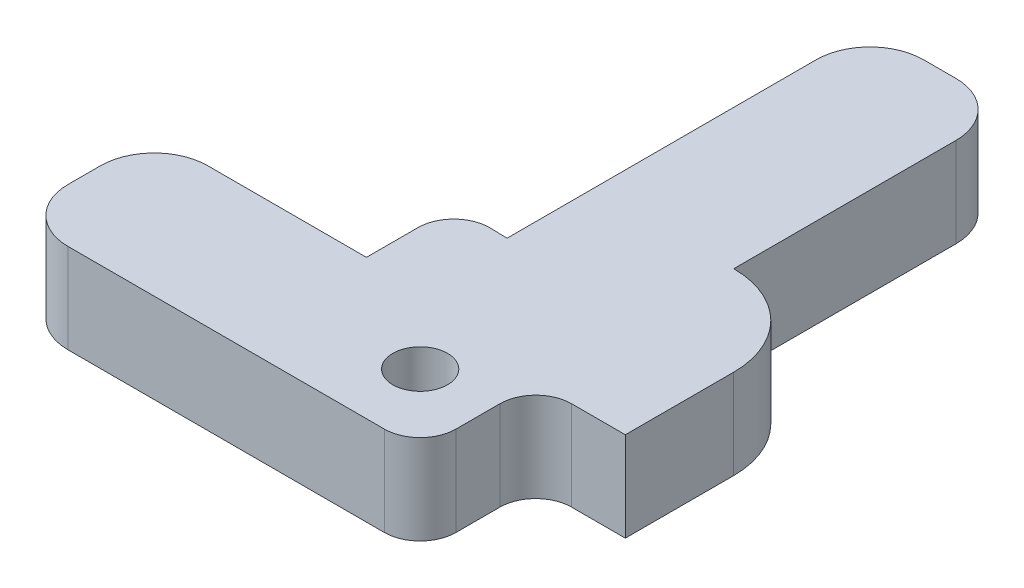
ISO-10303-21;
HEADER;
FILE_DESCRIPTION(('STEP AP214'),'2;1');
FILE_NAME('part.step','',(''),(''),'','','');
FILE_SCHEMA(('AUTOMOTIVE_DESIGN { 1 0 10303 214 1 1 1 1 }'));
ENDSEC;
DATA;
#1=APPLICATION_CONTEXT('core data for automotive mechanical design processes');
#2=APPLICATION_PROTOCOL_DEFINITION('international standard','automotive_design',2000,#1);
#3=PRODUCT_CONTEXT('',#1,'mechanical');
#4=PRODUCT('Part','Part','',(#3));
#5=PRODUCT_RELATED_PRODUCT_CATEGORY('part','',(#4));
#6=PRODUCT_DEFINITION_FORMATION('','',#4);
#7=PRODUCT_DEFINITION_CONTEXT('part definition',#1,'design');
#8=PRODUCT_DEFINITION('design','',#6,#7);
#9=PRODUCT_DEFINITION_SHAPE('','',#8);
#10=(LENGTH_UNIT() NAMED_UNIT(*) SI_UNIT(.MILLI.,.METRE.));
#11=(NAMED_UNIT(*) PLANE_ANGLE_UNIT() SI_UNIT($,.RADIAN.));
#12=(NAMED_UNIT(*) SI_UNIT($,.STERADIAN.) SOLID_ANGLE_UNIT());
#13=UNCERTAINTY_MEASURE_WITH_UNIT(LENGTH_MEASURE(1.E-05),#10,'distance_accuracy_value','');
#14=(GEOMETRIC_REPRESENTATION_CONTEXT(3) GLOBAL_UNCERTAINTY_ASSIGNED_CONTEXT((#13)) GLOBAL_UNIT_ASSIGNED_CONTEXT((#10,
#11,#12)) REPRESENTATION_CONTEXT('',''));
#15=CARTESIAN_POINT('',(0.,0.,0.));
#16=DIRECTION('',(0.,0.,1.));
#17=DIRECTION('',(1.,0.,0.));
#18=AXIS2_PLACEMENT_3D('',#15,#16,#17);
#19=CARTESIAN_POINT('',(0.211176136896889,5.,-8.64962778558641));
#20=DIRECTION('',(-0.0244072037228938,0.,0.999702099830959));
#21=DIRECTION('',(0.999702099830959,0.,0.0244072037228938));
#22=AXIS2_PLACEMENT_3D('',#19,#20,#21);
#23=PLANE('',#22);
#24=DIRECTION('',(0.,-1.,0.));
#25=VECTOR('',#24,1.);
#26=CARTESIAN_POINT('',(-3.9,5.,-8.75));
#27=LINE('',#26,#25);
#28=CARTESIAN_POINT('',(-3.9,5.,-8.75));
#29=VERTEX_POINT('',#28);
#30=CARTESIAN_POINT('',(-3.9,0.,-8.75));
#31=VERTEX_POINT('',#30);
#32=EDGE_CURVE('E300',#29,#31,#27,.T.);
#33=ORIENTED_EDGE('',*,*,#32,.T.);
#34=DIRECTION('',(0.,1.,0.));
#35=VECTOR('',#34,1.);
#36=CARTESIAN_POINT('',(-3.9,-4.,-8.75));
#37=LINE('',#36,#35);
#38=CARTESIAN_POINT('',(-3.9,-4.,-8.75));
#39=VERTEX_POINT('',#38);
#40=EDGE_CURVE('E233',#39,#31,#37,.T.);
#41=ORIENTED_EDGE('',*,*,#40,.F.);
#42=DIRECTION('',(-0.999702099830959,0.,-0.0244072037228938));
#43=VECTOR('',#42,1.);
#44=CARTESIAN_POINT('',(-3.9,-4.,-8.75));
#45=LINE('',#44,#43);
#46=CARTESIAN_POINT('',(-4.8511855925542,-4.,-8.77322269858158));
#47=VERTEX_POINT('',#46);
#48=EDGE_CURVE('E225',#39,#47,#45,.T.);
#49=ORIENTED_EDGE('',*,*,#48,.T.);
#50=DIRECTION('',(0.,-1.,0.));
#51=VECTOR('',#50,1.);
#52=CARTESIAN_POINT('',(-4.8511855925542,5.,-8.77322269858158));
#53=LINE('',#52,#51);
#54=CARTESIAN_POINT('',(-4.8511855925542,5.,-8.77322269858158));
#55=VERTEX_POINT('',#54);
#56=EDGE_CURVE('E392',#55,#47,#53,.T.);
#57=ORIENTED_EDGE('',*,*,#56,.F.);
#58=DIRECTION('',(-0.999702099830959,0.,-0.0244072037228938));
#59=VECTOR('',#58,1.);
#60=CARTESIAN_POINT('',(0.211176136896889,5.,-8.64962778558641));
#61=LINE('',#60,#59);
#62=EDGE_CURVE('E243',#29,#55,#61,.T.);
#63=ORIENTED_EDGE('',*,*,#62,.F.);
#64=EDGE_LOOP('',(#33,#41,#49,#57,#63));
#65=FACE_BOUND('',#64,.T.);
#66=ADVANCED_FACE('F42',(#65),#23,.F.);
#67=CARTESIAN_POINT('',(-4.9,5.,-6.77381849891966));
#68=DIRECTION('',(0.,-1.,0.));
#69=DIRECTION('',(0.,0.,-1.));
#70=AXIS2_PLACEMENT_3D('',#67,#68,#69);
#71=CYLINDRICAL_SURFACE('',#70,2.);
#72=ORIENTED_EDGE('',*,*,#56,.T.);
#73=CARTESIAN_POINT('',(-4.9,-4.,-6.77381849891966));
#74=DIRECTION('',(0.,1.,0.));
#75=DIRECTION('',(0.,0.,1.));
#76=AXIS2_PLACEMENT_3D('',#73,#74,#75);
#77=CIRCLE('',#76,2.);
#78=CARTESIAN_POINT('',(-6.9,-4.,-6.77381849891965));
#79=VERTEX_POINT('',#78);
#80=EDGE_CURVE('E198',#47,#79,#77,.T.);
#81=ORIENTED_EDGE('',*,*,#80,.T.);
#82=DIRECTION('',(0.,-1.,0.));
#83=VECTOR('',#82,1.);
#84=CARTESIAN_POINT('',(-6.9,5.,-6.77381849891965));
#85=LINE('',#84,#83);
#86=CARTESIAN_POINT('',(-6.9,5.,-6.77381849891965));
#87=VERTEX_POINT('',#86);
#88=EDGE_CURVE('E215',#87,#79,#85,.T.);
#89=ORIENTED_EDGE('',*,*,#88,.F.);
#90=CARTESIAN_POINT('',(-4.9,5.,-6.77381849891966));
#91=DIRECTION('',(0.,1.,0.));
#92=DIRECTION('',(0.,0.,1.));
#93=AXIS2_PLACEMENT_3D('',#90,#91,#92);
#94=CIRCLE('',#93,2.);
#95=EDGE_CURVE('E248',#55,#87,#94,.T.);
#96=ORIENTED_EDGE('',*,*,#95,.F.);
#97=EDGE_LOOP('',(#72,#81,#89,#96));
#98=FACE_BOUND('',#97,.T.);
#99=ADVANCED_FACE('F467',(#98),#71,.T.);
#100=CARTESIAN_POINT('',(-6.9,5.,0.));
#101=DIRECTION('',(1.,0.,0.));
#102=DIRECTION('',(0.,0.,-1.));
#103=AXIS2_PLACEMENT_3D('',#100,#101,#102);
#104=PLANE('',#103);
#105=ORIENTED_EDGE('',*,*,#88,.T.);
#106=DIRECTION('',(0.,0.,1.));
#107=VECTOR('',#106,1.);
#108=CARTESIAN_POINT('',(-6.9,-4.,-6.77381849891965));
#109=LINE('',#108,#107);
#110=CARTESIAN_POINT('',(-6.9,-4.,-3.9));
#111=VERTEX_POINT('',#110);
#112=EDGE_CURVE('E205',#79,#111,#109,.T.);
#113=ORIENTED_EDGE('',*,*,#112,.T.);
#114=DIRECTION('',(0.,1.,0.));
#115=VECTOR('',#114,1.);
#116=CARTESIAN_POINT('',(-6.9,-4.,-3.9));
#117=LINE('',#116,#115);
#118=CARTESIAN_POINT('',(-6.9,0.,-3.9));
#119=VERTEX_POINT('',#118);
#120=EDGE_CURVE('E186',#111,#119,#117,.T.);
#121=ORIENTED_EDGE('',*,*,#120,.T.);
#122=DIRECTION('',(0.,-1.,0.));
#123=VECTOR('',#122,1.);
#124=CARTESIAN_POINT('',(-6.9,5.,-3.9));
#125=LINE('',#124,#123);
#126=CARTESIAN_POINT('',(-6.9,5.,-3.9));
#127=VERTEX_POINT('',#126);
#128=EDGE_CURVE('E387',#127,#119,#125,.T.);
#129=ORIENTED_EDGE('',*,*,#128,.F.);
#130=DIRECTION('',(0.,0.,1.));
#131=VECTOR('',#130,1.);
#132=CARTESIAN_POINT('',(-6.9,5.,0.));
#133=LINE('',#132,#131);
#134=EDGE_CURVE('E251',#87,#127,#133,.T.);
#135=ORIENTED_EDGE('',*,*,#134,.F.);
#136=EDGE_LOOP('',(#105,#113,#121,#129,#135));
#137=FACE_BOUND('',#136,.T.);
#138=ADVANCED_FACE('F212',(#137),#104,.F.);
#139=CARTESIAN_POINT('',(0.,5.,-3.9));
#140=DIRECTION('',(0.,0.,1.));
#141=DIRECTION('',(1.,0.,0.));
#142=AXIS2_PLACEMENT_3D('',#139,#140,#141);
#143=PLANE('',#142);
#144=DIRECTION('',(-1.,0.,0.));
#145=VECTOR('',#144,1.);
#146=CARTESIAN_POINT('',(0.,0.,-3.9));
#147=LINE('',#146,#145);
#148=CARTESIAN_POINT('',(-15.75,0.,-3.9));
#149=VERTEX_POINT('',#148);
#150=EDGE_CURVE('E304',#119,#149,#147,.T.);
#151=ORIENTED_EDGE('',*,*,#150,.T.);
#152=DIRECTION('',(0.,-1.,0.));
#153=VECTOR('',#152,1.);
#154=CARTESIAN_POINT('',(-15.75,5.,-3.9));
#155=LINE('',#154,#153);
#156=CARTESIAN_POINT('',(-15.75,5.,-3.9));
#157=VERTEX_POINT('',#156);
#158=EDGE_CURVE('E383',#157,#149,#155,.T.);
#159=ORIENTED_EDGE('',*,*,#158,.F.);
#160=DIRECTION('',(-1.,0.,0.));
#161=VECTOR('',#160,1.);
#162=CARTESIAN_POINT('',(0.,5.,-3.9));
#163=LINE('',#162,#161);
#164=EDGE_CURVE('E254',#127,#157,#163,.T.);
#165=ORIENTED_EDGE('',*,*,#164,.F.);
#166=ORIENTED_EDGE('',*,*,#128,.T.);
#167=EDGE_LOOP('',(#151,#159,#165,#166));
#168=FACE_BOUND('',#167,.T.);
#169=ADVANCED_FACE('F472',(#168),#143,.F.);
#170=CARTESIAN_POINT('',(-15.75,5.,-0.9));
#171=DIRECTION('',(0.,-1.,0.));
#172=DIRECTION('',(0.,0.,-1.));
#173=AXIS2_PLACEMENT_3D('',#170,#171,#172);
#174=CYLINDRICAL_SURFACE('',#173,3.);
#175=CARTESIAN_POINT('',(-15.75,0.,-0.9));
#176=DIRECTION('',(0.,1.,0.));
#177=DIRECTION('',(0.,0.,1.));
#178=AXIS2_PLACEMENT_3D('',#175,#176,#177);
#179=CIRCLE('',#178,3.);
#180=CARTESIAN_POINT('',(-18.75,0.,-0.899999999999978));
#181=VERTEX_POINT('',#180);
#182=EDGE_CURVE('E307',#149,#181,#179,.T.);
#183=ORIENTED_EDGE('',*,*,#182,.T.);
#184=DIRECTION('',(0.,-1.,0.));
#185=VECTOR('',#184,1.);
#186=CARTESIAN_POINT('',(-18.75,5.,-0.899999999999978));
#187=LINE('',#186,#185);
#188=CARTESIAN_POINT('',(-18.75,5.,-0.899999999999978));
#189=VERTEX_POINT('',#188);
#190=EDGE_CURVE('E379',#189,#181,#187,.T.);
#191=ORIENTED_EDGE('',*,*,#190,.F.);
#192=CARTESIAN_POINT('',(-15.75,5.,-0.9));
#193=DIRECTION('',(0.,1.,0.));
#194=DIRECTION('',(0.,0.,1.));
#195=AXIS2_PLACEMENT_3D('',#192,#193,#194);
#196=CIRCLE('',#195,3.);
#197=EDGE_CURVE('E257',#157,#189,#196,.T.);
#198=ORIENTED_EDGE('',*,*,#197,.F.);
#199=ORIENTED_EDGE('',*,*,#158,.T.);
#200=EDGE_LOOP('',(#183,#191,#198,#199));
#201=FACE_BOUND('',#200,.T.);
#202=ADVANCED_FACE('F478',(#201),#174,.T.);
#203=CARTESIAN_POINT('',(-18.75,5.,0.));
#204=DIRECTION('',(1.,0.,0.));
#205=DIRECTION('',(0.,0.,-1.));
#206=AXIS2_PLACEMENT_3D('',#203,#204,#205);
#207=PLANE('',#206);
#208=DIRECTION('',(0.,0.,1.));
#209=VECTOR('',#208,1.);
#210=CARTESIAN_POINT('',(-18.75,0.,0.));
#211=LINE('',#210,#209);
#212=CARTESIAN_POINT('',(-18.75,0.,0.899999999999981));
#213=VERTEX_POINT('',#212);
#214=EDGE_CURVE('E310',#181,#213,#211,.T.);
#215=ORIENTED_EDGE('',*,*,#214,.T.);
#216=DIRECTION('',(0.,-1.,0.));
#217=VECTOR('',#216,1.);
#218=CARTESIAN_POINT('',(-18.75,5.,0.899999999999981));
#219=LINE('',#218,#217);
#220=CARTESIAN_POINT('',(-18.75,5.,0.899999999999981));
#221=VERTEX_POINT('',#220);
#222=EDGE_CURVE('E375',#221,#213,#219,.T.);
#223=ORIENTED_EDGE('',*,*,#222,.F.);
#224=DIRECTION('',(0.,0.,1.));
#225=VECTOR('',#224,1.);
#226=CARTESIAN_POINT('',(-18.75,5.,0.));
#227=LINE('',#226,#225);
#228=EDGE_CURVE('E260',#189,#221,#227,.T.);
#229=ORIENTED_EDGE('',*,*,#228,.F.);
#230=ORIENTED_EDGE('',*,*,#190,.T.);
#231=EDGE_LOOP('',(#215,#223,#229,#230));
#232=FACE_BOUND('',#231,.T.);
#233=ADVANCED_FACE('F482',(#232),#207,.F.);
#234=CARTESIAN_POINT('',(-15.75,5.,0.900000000000003));
#235=DIRECTION('',(0.,-1.,0.));
#236=DIRECTION('',(0.,0.,-1.));
#237=AXIS2_PLACEMENT_3D('',#234,#235,#236);
#238=CYLINDRICAL_SURFACE('',#237,3.);
#239=CARTESIAN_POINT('',(-15.75,0.,0.900000000000003));
#240=DIRECTION('',(0.,1.,0.));
#241=DIRECTION('',(0.,0.,1.));
#242=AXIS2_PLACEMENT_3D('',#239,#240,#241);
#243=CIRCLE('',#242,3.);
#244=CARTESIAN_POINT('',(-15.75,0.,3.9));
#245=VERTEX_POINT('',#244);
#246=EDGE_CURVE('E313',#213,#245,#243,.T.);
#247=ORIENTED_EDGE('',*,*,#246,.T.);
#248=DIRECTION('',(0.,-1.,0.));
#249=VECTOR('',#248,1.);
#250=CARTESIAN_POINT('',(-15.75,5.,3.9));
#251=LINE('',#250,#249);
#252=CARTESIAN_POINT('',(-15.75,5.,3.9));
#253=VERTEX_POINT('',#252);
#254=EDGE_CURVE('E371',#253,#245,#251,.T.);
#255=ORIENTED_EDGE('',*,*,#254,.F.);
#256=CARTESIAN_POINT('',(-15.75,5.,0.900000000000003));
#257=DIRECTION('',(0.,1.,0.));
#258=DIRECTION('',(0.,0.,1.));
#259=AXIS2_PLACEMENT_3D('',#256,#257,#258);
#260=CIRCLE('',#259,3.);
#261=EDGE_CURVE('E263',#221,#253,#260,.T.);
#262=ORIENTED_EDGE('',*,*,#261,.F.);
#263=ORIENTED_EDGE('',*,*,#222,.T.);
#264=EDGE_LOOP('',(#247,#255,#262,#263));
#265=FACE_BOUND('',#264,.T.);
#266=ADVANCED_FACE('F487',(#265),#238,.T.);
#267=CARTESIAN_POINT('',(0.,5.,3.9));
#268=DIRECTION('',(0.,0.,-1.));
#269=DIRECTION('',(-1.,0.,0.));
#270=AXIS2_PLACEMENT_3D('',#267,#268,#269);
#271=PLANE('',#270);
#272=DIRECTION('',(1.,0.,0.));
#273=VECTOR('',#272,1.);
#274=CARTESIAN_POINT('',(0.,0.,3.9));
#275=LINE('',#274,#273);
#276=CARTESIAN_POINT('',(1.9,0.,3.9));
#277=VERTEX_POINT('',#276);
#278=EDGE_CURVE('E316',#245,#277,#275,.T.);
#279=ORIENTED_EDGE('',*,*,#278,.T.);
#280=DIRECTION('',(0.,-1.,0.));
#281=VECTOR('',#280,1.);
#282=CARTESIAN_POINT('',(1.9,5.,3.9));
#283=LINE('',#282,#281);
#284=CARTESIAN_POINT('',(1.9,5.,3.9));
#285=VERTEX_POINT('',#284);
#286=EDGE_CURVE('E402',#277,#285,#283,.F.);
#287=ORIENTED_EDGE('',*,*,#286,.T.);
#288=DIRECTION('',(1.,0.,0.));
#289=VECTOR('',#288,1.);
#290=CARTESIAN_POINT('',(0.,5.,3.9));
#291=LINE('',#290,#289);
#292=EDGE_CURVE('E266',#253,#285,#291,.T.);
#293=ORIENTED_EDGE('',*,*,#292,.F.);
#294=ORIENTED_EDGE('',*,*,#254,.T.);
#295=EDGE_LOOP('',(#279,#287,#293,#294));
#296=FACE_BOUND('',#295,.T.);
#297=ADVANCED_FACE('F497',(#296),#271,.F.);
#298=CARTESIAN_POINT('',(3.9,5.,0.));
#299=DIRECTION('',(-1.,0.,0.));
#300=DIRECTION('',(0.,0.,1.));
#301=AXIS2_PLACEMENT_3D('',#298,#299,#300);
#302=PLANE('',#301);
#303=DIRECTION('',(0.,0.,-1.));
#304=VECTOR('',#303,1.);
#305=CARTESIAN_POINT('',(3.9,0.,0.));
#306=LINE('',#305,#304);
#307=CARTESIAN_POINT('',(3.9,0.,1.9));
#308=VERTEX_POINT('',#307);
#309=CARTESIAN_POINT('',(3.9,0.,-0.549999999999999));
#310=VERTEX_POINT('',#309);
#311=EDGE_CURVE('E320',#308,#310,#306,.T.);
#312=ORIENTED_EDGE('',*,*,#311,.T.);
#313=DIRECTION('',(0.,-1.,0.));
#314=VECTOR('',#313,1.);
#315=CARTESIAN_POINT('',(3.9,5.,-0.549999999999999));
#316=LINE('',#315,#314);
#317=CARTESIAN_POINT('',(3.9,5.,-0.549999999999999));
#318=VERTEX_POINT('',#317);
#319=EDGE_CURVE('E64',#310,#318,#316,.F.);
#320=ORIENTED_EDGE('',*,*,#319,.T.);
#321=DIRECTION('',(0.,0.,-1.));
#322=VECTOR('',#321,1.);
#323=CARTESIAN_POINT('',(3.9,5.,0.));
#324=LINE('',#323,#322);
#325=CARTESIAN_POINT('',(3.9,5.,1.9));
#326=VERTEX_POINT('',#325);
#327=EDGE_CURVE('E270',#326,#318,#324,.T.);
#328=ORIENTED_EDGE('',*,*,#327,.F.);
#329=DIRECTION('',(0.,-1.,0.));
#330=VECTOR('',#329,1.);
#331=CARTESIAN_POINT('',(3.9,5.,1.9));
#332=LINE('',#331,#330);
#333=EDGE_CURVE('E395',#326,#308,#332,.T.);
#334=ORIENTED_EDGE('',*,*,#333,.T.);
#335=EDGE_LOOP('',(#312,#320,#328,#334));
#336=FACE_BOUND('',#335,.T.);
#337=ADVANCED_FACE('F495',(#336),#302,.F.);
#338=CARTESIAN_POINT('',(0.,5.,-2.55));
#339=DIRECTION('',(0.,0.,1.));
#340=DIRECTION('',(1.,0.,0.));
#341=AXIS2_PLACEMENT_3D('',#338,#339,#340);
#342=PLANE('',#341);
#343=DIRECTION('',(-1.,0.,0.));
#344=VECTOR('',#343,1.);
#345=CARTESIAN_POINT('',(0.,5.,-2.55));
#346=LINE('',#345,#344);
#347=CARTESIAN_POINT('',(8.9,5.,-2.55));
#348=VERTEX_POINT('',#347);
#349=CARTESIAN_POINT('',(5.9,5.,-2.55));
#350=VERTEX_POINT('',#349);
#351=EDGE_CURVE('E273',#348,#350,#346,.T.);
#352=ORIENTED_EDGE('',*,*,#351,.T.);
#353=DIRECTION('',(0.,-1.,0.));
#354=VECTOR('',#353,1.);
#355=CARTESIAN_POINT('',(5.9,5.,-2.55));
#356=LINE('',#355,#354);
#357=CARTESIAN_POINT('',(5.9,0.,-2.55));
#358=VERTEX_POINT('',#357);
#359=EDGE_CURVE('E417',#350,#358,#356,.T.);
#360=ORIENTED_EDGE('',*,*,#359,.T.);
#361=DIRECTION('',(-1.,0.,0.));
#362=VECTOR('',#361,1.);
#363=CARTESIAN_POINT('',(0.,0.,-2.55));
#364=LINE('',#363,#362);
#365=CARTESIAN_POINT('',(8.9,0.,-2.55));
#366=VERTEX_POINT('',#365);
#367=EDGE_CURVE('E323',#366,#358,#364,.T.);
#368=ORIENTED_EDGE('',*,*,#367,.F.);
#369=DIRECTION('',(0.,-1.,0.));
#370=VECTOR('',#369,1.);
#371=CARTESIAN_POINT('',(8.9,5.,-2.55));
#372=LINE('',#371,#370);
#373=EDGE_CURVE('E368',#348,#366,#372,.T.);
#374=ORIENTED_EDGE('',*,*,#373,.F.);
#375=EDGE_LOOP('',(#352,#360,#368,#374));
#376=FACE_BOUND('',#375,.T.);
#377=ADVANCED_FACE('F426',(#376),#342,.T.);
#378=CARTESIAN_POINT('',(8.9,5.,0.));
#379=DIRECTION('',(-1.,0.,0.));
#380=DIRECTION('',(0.,0.,1.));
#381=AXIS2_PLACEMENT_3D('',#378,#379,#380);
#382=PLANE('',#381);
#383=DIRECTION('',(0.,0.,-1.));
#384=VECTOR('',#383,1.);
#385=CARTESIAN_POINT('',(8.9,0.,0.));
#386=LINE('',#385,#384);
#387=CARTESIAN_POINT('',(8.9,0.,-8.6));
#388=VERTEX_POINT('',#387);
#389=EDGE_CURVE('E326',#366,#388,#386,.T.);
#390=ORIENTED_EDGE('',*,*,#389,.T.);
#391=DIRECTION('',(0.,-1.,0.));
#392=VECTOR('',#391,1.);
#393=CARTESIAN_POINT('',(8.9,5.,-8.6));
#394=LINE('',#393,#392);
#395=CARTESIAN_POINT('',(8.9,5.,-8.6));
#396=VERTEX_POINT('',#395);
#397=EDGE_CURVE('E411',#388,#396,#394,.F.);
#398=ORIENTED_EDGE('',*,*,#397,.T.);
#399=DIRECTION('',(0.,0.,-1.));
#400=VECTOR('',#399,1.);
#401=CARTESIAN_POINT('',(8.9,5.,0.));
#402=LINE('',#401,#400);
#403=EDGE_CURVE('E277',#348,#396,#402,.T.);
#404=ORIENTED_EDGE('',*,*,#403,.F.);
#405=ORIENTED_EDGE('',*,*,#373,.T.);
#406=EDGE_LOOP('',(#390,#398,#404,#405));
#407=FACE_BOUND('',#406,.T.);
#408=ADVANCED_FACE('F435',(#407),#382,.F.);
#409=CARTESIAN_POINT('',(3.9,5.,0.));
#410=DIRECTION('',(-1.,0.,0.));
#411=DIRECTION('',(0.,0.,1.));
#412=AXIS2_PLACEMENT_3D('',#409,#410,#411);
#413=PLANE('',#412);
#414=DIRECTION('',(0.,0.,-1.));
#415=VECTOR('',#414,1.);
#416=CARTESIAN_POINT('',(3.9,0.,0.));
#417=LINE('',#416,#415);
#418=CARTESIAN_POINT('',(3.9,0.,-13.6));
#419=VERTEX_POINT('',#418);
#420=CARTESIAN_POINT('',(3.9,0.,-26.));
#421=VERTEX_POINT('',#420);
#422=EDGE_CURVE('E330',#419,#421,#417,.T.);
#423=ORIENTED_EDGE('',*,*,#422,.T.);
#424=DIRECTION('',(0.,-1.,0.));
#425=VECTOR('',#424,1.);
#426=CARTESIAN_POINT('',(3.9,5.,-26.));
#427=LINE('',#426,#425);
#428=CARTESIAN_POINT('',(3.9,5.,-26.));
#429=VERTEX_POINT('',#428);
#430=EDGE_CURVE('E361',#429,#421,#427,.T.);
#431=ORIENTED_EDGE('',*,*,#430,.F.);
#432=DIRECTION('',(0.,0.,-1.));
#433=VECTOR('',#432,1.);
#434=CARTESIAN_POINT('',(3.9,5.,0.));
#435=LINE('',#434,#433);
#436=CARTESIAN_POINT('',(3.9,5.,-13.6));
#437=VERTEX_POINT('',#436);
#438=EDGE_CURVE('E281',#437,#429,#435,.T.);
#439=ORIENTED_EDGE('',*,*,#438,.F.);
#440=DIRECTION('',(0.,-1.,0.));
#441=VECTOR('',#440,1.);
#442=CARTESIAN_POINT('',(3.9,5.,-13.6));
#443=LINE('',#442,#441);
#444=EDGE_CURVE('E364',#437,#419,#443,.T.);
#445=ORIENTED_EDGE('',*,*,#444,.T.);
#446=EDGE_LOOP('',(#423,#431,#439,#445));
#447=FACE_BOUND('',#446,.T.);
#448=ADVANCED_FACE('F447',(#447),#413,.F.);
#449=CARTESIAN_POINT('',(0.9,5.,-26.));
#450=DIRECTION('',(0.,-1.,0.));
#451=DIRECTION('',(0.,0.,-1.));
#452=AXIS2_PLACEMENT_3D('',#449,#450,#451);
#453=CYLINDRICAL_SURFACE('',#452,3.);
#454=CARTESIAN_POINT('',(0.9,0.,-26.));
#455=DIRECTION('',(0.,1.,0.));
#456=DIRECTION('',(0.,0.,1.));
#457=AXIS2_PLACEMENT_3D('',#454,#455,#456);
#458=CIRCLE('',#457,3.);
#459=CARTESIAN_POINT('',(0.899999999999978,0.,-29.));
#460=VERTEX_POINT('',#459);
#461=EDGE_CURVE('E334',#460,#421,#458,.F.);
#462=ORIENTED_EDGE('',*,*,#461,.F.);
#463=DIRECTION('',(0.,-1.,0.));
#464=VECTOR('',#463,1.);
#465=CARTESIAN_POINT('',(0.899999999999978,5.,-29.));
#466=LINE('',#465,#464);
#467=CARTESIAN_POINT('',(0.899999999999978,5.,-29.));
#468=VERTEX_POINT('',#467);
#469=EDGE_CURVE('E358',#468,#460,#466,.T.);
#470=ORIENTED_EDGE('',*,*,#469,.F.);
#471=CARTESIAN_POINT('',(0.9,5.,-26.));
#472=DIRECTION('',(0.,1.,0.));
#473=DIRECTION('',(0.,0.,1.));
#474=AXIS2_PLACEMENT_3D('',#471,#472,#473);
#475=CIRCLE('',#474,3.);
#476=EDGE_CURVE('E284',#468,#429,#475,.F.);
#477=ORIENTED_EDGE('',*,*,#476,.T.);
#478=ORIENTED_EDGE('',*,*,#430,.T.);
#479=EDGE_LOOP('',(#462,#470,#477,#478));
#480=FACE_BOUND('',#479,.T.);
#481=ADVANCED_FACE('F450',(#480),#453,.T.);
#482=CARTESIAN_POINT('',(0.,5.,-29.));
#483=DIRECTION('',(0.,0.,-1.));
#484=DIRECTION('',(-1.,0.,0.));
#485=AXIS2_PLACEMENT_3D('',#482,#483,#484);
#486=PLANE('',#485);
#487=DIRECTION('',(1.,0.,0.));
#488=VECTOR('',#487,1.);
#489=CARTESIAN_POINT('',(0.,0.,-29.));
#490=LINE('',#489,#488);
#491=CARTESIAN_POINT('',(-0.899999999999979,0.,-29.));
#492=VERTEX_POINT('',#491);
#493=EDGE_CURVE('E338',#492,#460,#490,.T.);
#494=ORIENTED_EDGE('',*,*,#493,.F.);
#495=DIRECTION('',(0.,-1.,0.));
#496=VECTOR('',#495,1.);
#497=CARTESIAN_POINT('',(-0.899999999999979,5.,-29.));
#498=LINE('',#497,#496);
#499=CARTESIAN_POINT('',(-0.899999999999979,5.,-29.));
#500=VERTEX_POINT('',#499);
#501=EDGE_CURVE('E355',#500,#492,#498,.T.);
#502=ORIENTED_EDGE('',*,*,#501,.F.);
#503=DIRECTION('',(1.,0.,0.));
#504=VECTOR('',#503,1.);
#505=CARTESIAN_POINT('',(0.,5.,-29.));
#506=LINE('',#505,#504);
#507=EDGE_CURVE('E288',#500,#468,#506,.T.);
#508=ORIENTED_EDGE('',*,*,#507,.T.);
#509=ORIENTED_EDGE('',*,*,#469,.T.);
#510=EDGE_LOOP('',(#494,#502,#508,#509));
#511=FACE_BOUND('',#510,.T.);
#512=ADVANCED_FACE('F455',(#511),#486,.T.);
#513=CARTESIAN_POINT('',(-0.9,5.,-26.));
#514=DIRECTION('',(0.,-1.,0.));
#515=DIRECTION('',(0.,0.,-1.));
#516=AXIS2_PLACEMENT_3D('',#513,#514,#515);
#517=CYLINDRICAL_SURFACE('',#516,3.);
#518=CARTESIAN_POINT('',(-0.9,0.,-26.));
#519=DIRECTION('',(0.,1.,0.));
#520=DIRECTION('',(0.,0.,1.));
#521=AXIS2_PLACEMENT_3D('',#518,#519,#520);
#522=CIRCLE('',#521,3.);
#523=CARTESIAN_POINT('',(-3.9,0.,-26.));
#524=VERTEX_POINT('',#523);
#525=EDGE_CURVE('E342',#524,#492,#522,.F.);
#526=ORIENTED_EDGE('',*,*,#525,.F.);
#527=DIRECTION('',(0.,-1.,0.));
#528=VECTOR('',#527,1.);
#529=CARTESIAN_POINT('',(-3.9,5.,-26.));
#530=LINE('',#529,#528);
#531=CARTESIAN_POINT('',(-3.9,5.,-26.));
#532=VERTEX_POINT('',#531);
#533=EDGE_CURVE('E352',#532,#524,#530,.T.);
#534=ORIENTED_EDGE('',*,*,#533,.F.);
#535=CARTESIAN_POINT('',(-0.9,5.,-26.));
#536=DIRECTION('',(0.,1.,0.));
#537=DIRECTION('',(0.,0.,1.));
#538=AXIS2_PLACEMENT_3D('',#535,#536,#537);
#539=CIRCLE('',#538,3.);
#540=EDGE_CURVE('E292',#532,#500,#539,.F.);
#541=ORIENTED_EDGE('',*,*,#540,.T.);
#542=ORIENTED_EDGE('',*,*,#501,.T.);
#543=EDGE_LOOP('',(#526,#534,#541,#542));
#544=FACE_BOUND('',#543,.T.);
#545=ADVANCED_FACE('F458',(#544),#517,.T.);
#546=CARTESIAN_POINT('',(0.,5.,0.));
#547=DIRECTION('',(0.,-1.,0.));
#548=DIRECTION('',(0.,0.,-1.));
#549=AXIS2_PLACEMENT_3D('',#546,#547,#548);
#550=CYLINDRICAL_SURFACE('',#549,1.525);
#551=CARTESIAN_POINT('',(0.,5.,0.));
#552=DIRECTION('',(0.,1.,0.));
#553=DIRECTION('',(0.,0.,1.));
#554=AXIS2_PLACEMENT_3D('',#551,#552,#553);
#555=CIRCLE('',#554,1.525);
#556=CARTESIAN_POINT('',(0.,5.,1.525));
#557=VERTEX_POINT('',#556);
#558=EDGE_CURVE('E239',#557,#557,#555,.T.);
#559=ORIENTED_EDGE('',*,*,#558,.T.);
#560=EDGE_LOOP('',(#559));
#561=FACE_BOUND('',#560,.T.);
#562=CARTESIAN_POINT('',(0.,0.,0.));
#563=DIRECTION('',(0.,1.,0.));
#564=DIRECTION('',(0.,0.,1.));
#565=AXIS2_PLACEMENT_3D('',#562,#563,#564);
#566=CIRCLE('',#565,1.525);
#567=CARTESIAN_POINT('',(0.,0.,1.525));
#568=VERTEX_POINT('',#567);
#569=EDGE_CURVE('E236',#568,#568,#566,.T.);
#570=ORIENTED_EDGE('',*,*,#569,.F.);
#571=EDGE_LOOP('',(#570));
#572=FACE_BOUND('',#571,.T.);
#573=ADVANCED_FACE('F514',(#561,#572),#550,.F.);
#574=CARTESIAN_POINT('',(-3.9,5.,0.));
#575=DIRECTION('',(-1.,0.,0.));
#576=DIRECTION('',(0.,0.,1.));
#577=AXIS2_PLACEMENT_3D('',#574,#575,#576);
#578=PLANE('',#577);
#579=DIRECTION('',(0.,0.,-1.));
#580=VECTOR('',#579,1.);
#581=CARTESIAN_POINT('',(-3.9,0.,0.));
#582=LINE('',#581,#580);
#583=EDGE_CURVE('E244',#31,#524,#582,.T.);
#584=ORIENTED_EDGE('',*,*,#583,.F.);
#585=ORIENTED_EDGE('',*,*,#32,.F.);
#586=DIRECTION('',(0.,0.,-1.));
#587=VECTOR('',#586,1.);
#588=CARTESIAN_POINT('',(-3.9,5.,0.));
#589=LINE('',#588,#587);
#590=EDGE_CURVE('E296',#29,#532,#589,.T.);
#591=ORIENTED_EDGE('',*,*,#590,.T.);
#592=ORIENTED_EDGE('',*,*,#533,.T.);
#593=EDGE_LOOP('',(#584,#585,#591,#592));
#594=FACE_BOUND('',#593,.T.);
#595=ADVANCED_FACE('F462',(#594),#578,.T.);
#596=CARTESIAN_POINT('',(0.,5.,0.));
#597=DIRECTION('',(0.,1.,0.));
#598=DIRECTION('',(0.,0.,1.));
#599=AXIS2_PLACEMENT_3D('',#596,#597,#598);
#600=PLANE('',#599);
#601=ORIENTED_EDGE('',*,*,#558,.F.);
#602=EDGE_LOOP('',(#601));
#603=FACE_BOUND('',#602,.T.);
#604=ORIENTED_EDGE('',*,*,#403,.T.);
#605=CARTESIAN_POINT('',(3.9,5.,-8.6));
#606=DIRECTION('',(0.,1.,0.));
#607=DIRECTION('',(0.,0.,1.));
#608=AXIS2_PLACEMENT_3D('',#605,#606,#607);
#609=CIRCLE('',#608,5.);
#610=EDGE_CURVE('E414',#396,#437,#609,.T.);
#611=ORIENTED_EDGE('',*,*,#610,.T.);
#612=ORIENTED_EDGE('',*,*,#438,.T.);
#613=ORIENTED_EDGE('',*,*,#476,.F.);
#614=ORIENTED_EDGE('',*,*,#507,.F.);
#615=ORIENTED_EDGE('',*,*,#540,.F.);
#616=ORIENTED_EDGE('',*,*,#590,.F.);
#617=ORIENTED_EDGE('',*,*,#62,.T.);
#618=ORIENTED_EDGE('',*,*,#95,.T.);
#619=ORIENTED_EDGE('',*,*,#134,.T.);
#620=ORIENTED_EDGE('',*,*,#164,.T.);
#621=ORIENTED_EDGE('',*,*,#197,.T.);
#622=ORIENTED_EDGE('',*,*,#228,.T.);
#623=ORIENTED_EDGE('',*,*,#261,.T.);
#624=ORIENTED_EDGE('',*,*,#292,.T.);
#625=CARTESIAN_POINT('',(1.9,5.,1.9));
#626=DIRECTION('',(0.,1.,0.));
#627=DIRECTION('',(0.,0.,1.));
#628=AXIS2_PLACEMENT_3D('',#625,#626,#627);
#629=CIRCLE('',#628,2.);
#630=EDGE_CURVE('E405',#285,#326,#629,.T.);
#631=ORIENTED_EDGE('',*,*,#630,.T.);
#632=ORIENTED_EDGE('',*,*,#327,.T.);
#633=CARTESIAN_POINT('',(5.9,5.,-0.549999999999999));
#634=DIRECTION('',(0.,1.,0.));
#635=DIRECTION('',(0.,0.,1.));
#636=AXIS2_PLACEMENT_3D('',#633,#634,#635);
#637=CIRCLE('',#636,2.);
#638=EDGE_CURVE('E11',#318,#350,#637,.F.);
#639=ORIENTED_EDGE('',*,*,#638,.T.);
#640=ORIENTED_EDGE('',*,*,#351,.F.);
#641=EDGE_LOOP('',(#604,#611,#612,#613,#614,#615,#616,#617,#618,#619,#620,#621,#622,#623,#624,
#631,#632,#639,#640));
#642=FACE_BOUND('',#641,.T.);
#643=ADVANCED_FACE('F443',(#603,#642),#600,.T.);
#644=CARTESIAN_POINT('',(0.,0.,0.));
#645=DIRECTION('',(0.,1.,0.));
#646=DIRECTION('',(0.,0.,1.));
#647=AXIS2_PLACEMENT_3D('',#644,#645,#646);
#648=PLANE('',#647);
#649=ORIENTED_EDGE('',*,*,#569,.T.);
#650=EDGE_LOOP('',(#649));
#651=FACE_BOUND('',#650,.T.);
#652=ORIENTED_EDGE('',*,*,#422,.F.);
#653=CARTESIAN_POINT('',(3.9,0.,-8.6));
#654=DIRECTION('',(0.,1.,0.));
#655=DIRECTION('',(0.,0.,1.));
#656=AXIS2_PLACEMENT_3D('',#653,#654,#655);
#657=CIRCLE('',#656,5.);
#658=EDGE_CURVE('E408',#419,#388,#657,.F.);
#659=ORIENTED_EDGE('',*,*,#658,.T.);
#660=ORIENTED_EDGE('',*,*,#389,.F.);
#661=ORIENTED_EDGE('',*,*,#367,.T.);
#662=CARTESIAN_POINT('',(5.9,0.,-0.549999999999999));
#663=DIRECTION('',(0.,1.,0.));
#664=DIRECTION('',(0.,0.,1.));
#665=AXIS2_PLACEMENT_3D('',#662,#663,#664);
#666=CIRCLE('',#665,2.);
#667=EDGE_CURVE('E51',#358,#310,#666,.T.);
#668=ORIENTED_EDGE('',*,*,#667,.T.);
#669=ORIENTED_EDGE('',*,*,#311,.F.);
#670=CARTESIAN_POINT('',(1.9,0.,1.9));
#671=DIRECTION('',(0.,1.,0.));
#672=DIRECTION('',(0.,0.,1.));
#673=AXIS2_PLACEMENT_3D('',#670,#671,#672);
#674=CIRCLE('',#673,2.);
#675=EDGE_CURVE('E399',#308,#277,#674,.F.);
#676=ORIENTED_EDGE('',*,*,#675,.T.);
#677=ORIENTED_EDGE('',*,*,#278,.F.);
#678=ORIENTED_EDGE('',*,*,#246,.F.);
#679=ORIENTED_EDGE('',*,*,#214,.F.);
#680=ORIENTED_EDGE('',*,*,#182,.F.);
#681=ORIENTED_EDGE('',*,*,#150,.F.);
#682=DIRECTION('',(1.,0.,0.));
#683=VECTOR('',#682,1.);
#684=CARTESIAN_POINT('',(-6.9,0.,-3.9));
#685=LINE('',#684,#683);
#686=CARTESIAN_POINT('',(-3.9,0.,-3.9));
#687=VERTEX_POINT('',#686);
#688=EDGE_CURVE('E191',#119,#687,#685,.T.);
#689=ORIENTED_EDGE('',*,*,#688,.T.);
#690=DIRECTION('',(0.,0.,-1.));
#691=VECTOR('',#690,1.);
#692=CARTESIAN_POINT('',(-3.9,0.,-3.9));
#693=LINE('',#692,#691);
#694=EDGE_CURVE('E217',#687,#31,#693,.T.);
#695=ORIENTED_EDGE('',*,*,#694,.T.);
#696=ORIENTED_EDGE('',*,*,#583,.T.);
#697=ORIENTED_EDGE('',*,*,#525,.T.);
#698=ORIENTED_EDGE('',*,*,#493,.T.);
#699=ORIENTED_EDGE('',*,*,#461,.T.);
#700=EDGE_LOOP('',(#652,#659,#660,#661,#668,#669,#676,#677,#678,#679,#680,#681,#689,#695,#696,
#697,#698,#699));
#701=FACE_BOUND('',#700,.T.);
#702=ADVANCED_FACE('F432',(#651,#701),#648,.F.);
#703=CARTESIAN_POINT('',(-3.9,-4.,-3.9));
#704=DIRECTION('',(1.,0.,0.));
#705=DIRECTION('',(0.,0.,-1.));
#706=AXIS2_PLACEMENT_3D('',#703,#704,#705);
#707=PLANE('',#706);
#708=ORIENTED_EDGE('',*,*,#694,.F.);
#709=DIRECTION('',(0.,1.,0.));
#710=VECTOR('',#709,1.);
#711=CARTESIAN_POINT('',(-3.9,-4.,-3.9));
#712=LINE('',#711,#710);
#713=CARTESIAN_POINT('',(-3.9,-4.,-3.9));
#714=VERTEX_POINT('',#713);
#715=EDGE_CURVE('E197',#714,#687,#712,.T.);
#716=ORIENTED_EDGE('',*,*,#715,.F.);
#717=DIRECTION('',(0.,0.,-1.));
#718=VECTOR('',#717,1.);
#719=CARTESIAN_POINT('',(-3.9,-4.,-3.9));
#720=LINE('',#719,#718);
#721=EDGE_CURVE('E209',#714,#39,#720,.T.);
#722=ORIENTED_EDGE('',*,*,#721,.T.);
#723=ORIENTED_EDGE('',*,*,#40,.T.);
#724=EDGE_LOOP('',(#708,#716,#722,#723));
#725=FACE_BOUND('',#724,.T.);
#726=ADVANCED_FACE('F535',(#725),#707,.T.);
#727=CARTESIAN_POINT('',(-6.9,-4.,-3.9));
#728=DIRECTION('',(0.,0.,1.));
#729=DIRECTION('',(1.,0.,0.));
#730=AXIS2_PLACEMENT_3D('',#727,#728,#729);
#731=PLANE('',#730);
#732=ORIENTED_EDGE('',*,*,#688,.F.);
#733=ORIENTED_EDGE('',*,*,#120,.F.);
#734=DIRECTION('',(1.,0.,0.));
#735=VECTOR('',#734,1.);
#736=CARTESIAN_POINT('',(-6.9,-4.,-3.9));
#737=LINE('',#736,#735);
#738=EDGE_CURVE('E189',#111,#714,#737,.T.);
#739=ORIENTED_EDGE('',*,*,#738,.T.);
#740=ORIENTED_EDGE('',*,*,#715,.T.);
#741=EDGE_LOOP('',(#732,#733,#739,#740));
#742=FACE_BOUND('',#741,.T.);
#743=ADVANCED_FACE('F188',(#742),#731,.T.);
#744=CARTESIAN_POINT('',(-4.9,-4.,-6.77381849891966));
#745=DIRECTION('',(0.,1.,0.));
#746=DIRECTION('',(0.,0.,1.));
#747=AXIS2_PLACEMENT_3D('',#744,#745,#746);
#748=PLANE('',#747);
#749=ORIENTED_EDGE('',*,*,#112,.F.);
#750=ORIENTED_EDGE('',*,*,#80,.F.);
#751=ORIENTED_EDGE('',*,*,#48,.F.);
#752=ORIENTED_EDGE('',*,*,#721,.F.);
#753=ORIENTED_EDGE('',*,*,#738,.F.);
#754=EDGE_LOOP('',(#749,#750,#751,#752,#753));
#755=FACE_BOUND('',#754,.T.);
#756=ADVANCED_FACE('F203',(#755),#748,.F.);
#757=CARTESIAN_POINT('',(1.9,5.,1.9));
#758=DIRECTION('',(0.,-1.,0.));
#759=DIRECTION('',(0.,0.,-1.));
#760=AXIS2_PLACEMENT_3D('',#757,#758,#759);
#761=CYLINDRICAL_SURFACE('',#760,2.);
#762=ORIENTED_EDGE('',*,*,#630,.F.);
#763=ORIENTED_EDGE('',*,*,#286,.F.);
#764=ORIENTED_EDGE('',*,*,#675,.F.);
#765=ORIENTED_EDGE('',*,*,#333,.F.);
#766=EDGE_LOOP('',(#762,#763,#764,#765));
#767=FACE_BOUND('',#766,.T.);
#768=ADVANCED_FACE('F494',(#767),#761,.T.);
#769=CARTESIAN_POINT('',(3.9,5.,-8.6));
#770=DIRECTION('',(0.,-1.,0.));
#771=DIRECTION('',(0.,0.,-1.));
#772=AXIS2_PLACEMENT_3D('',#769,#770,#771);
#773=CYLINDRICAL_SURFACE('',#772,5.);
#774=ORIENTED_EDGE('',*,*,#610,.F.);
#775=ORIENTED_EDGE('',*,*,#397,.F.);
#776=ORIENTED_EDGE('',*,*,#658,.F.);
#777=ORIENTED_EDGE('',*,*,#444,.F.);
#778=EDGE_LOOP('',(#774,#775,#776,#777));
#779=FACE_BOUND('',#778,.T.);
#780=ADVANCED_FACE('F439',(#779),#773,.T.);
#781=CARTESIAN_POINT('',(5.9,5.,-0.549999999999999));
#782=DIRECTION('',(0.,-1.,0.));
#783=DIRECTION('',(0.,0.,-1.));
#784=AXIS2_PLACEMENT_3D('',#781,#782,#783);
#785=CYLINDRICAL_SURFACE('',#784,2.);
#786=ORIENTED_EDGE('',*,*,#638,.F.);
#787=ORIENTED_EDGE('',*,*,#319,.F.);
#788=ORIENTED_EDGE('',*,*,#667,.F.);
#789=ORIENTED_EDGE('',*,*,#359,.F.);
#790=EDGE_LOOP('',(#786,#787,#788,#789));
#791=FACE_BOUND('',#790,.T.);
#792=ADVANCED_FACE('F44',(#791),#785,.F.);
#793=CLOSED_SHELL('',(#66,#99,#138,#169,#202,#233,#266,#297,#337,#377,#408,#448,#481,#512,#545,
#573,#595,#643,#702,#726,#743,#756,#768,#780,#792));
#794=MANIFOLD_SOLID_BREP('B2',#793);
#795=ADVANCED_BREP_SHAPE_REPRESENTATION('',(#18,#794),#14);
#796=SHAPE_DEFINITION_REPRESENTATION(#9,#795);
ENDSEC;
END-ISO-10303-21;
